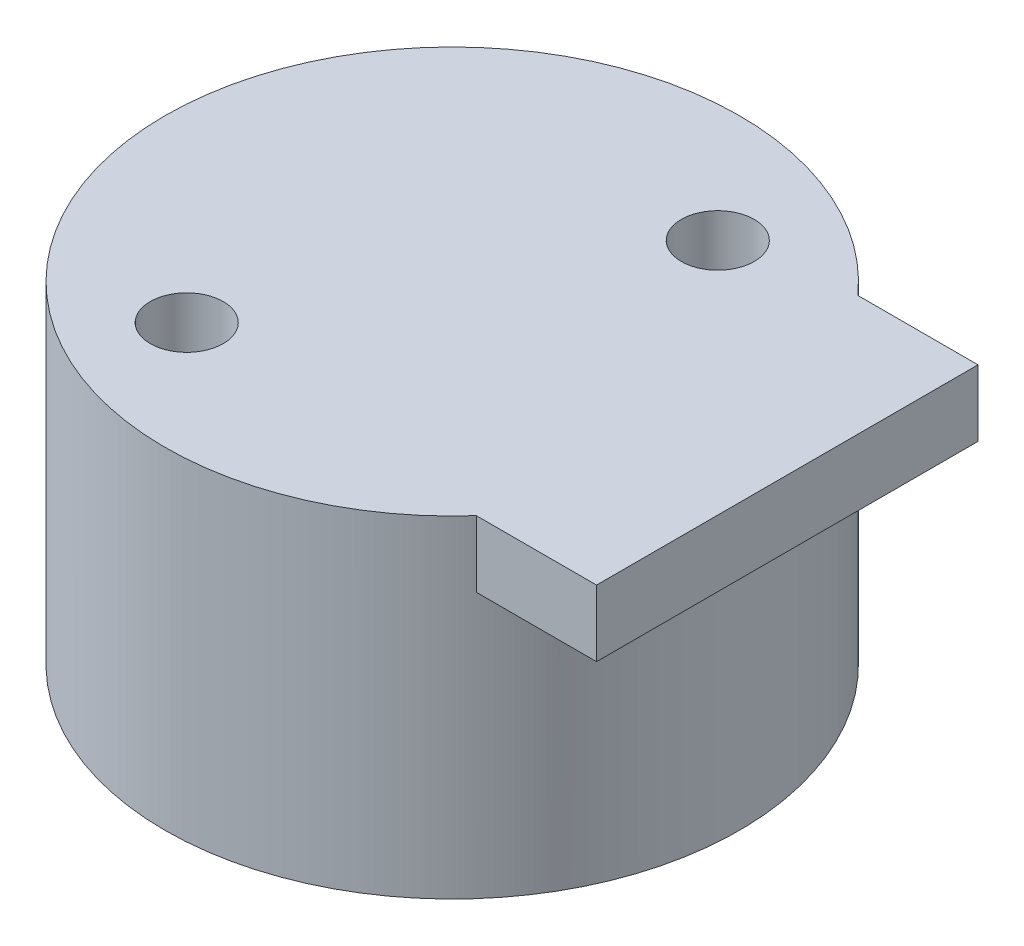
ISO-10303-21;
HEADER;
FILE_DESCRIPTION(('STEP AP214'),'2;1');
FILE_NAME('part.step','',(''),(''),'','','');
FILE_SCHEMA(('AUTOMOTIVE_DESIGN { 1 0 10303 214 1 1 1 1 }'));
ENDSEC;
DATA;
#1=APPLICATION_CONTEXT('core data for automotive mechanical design processes');
#2=APPLICATION_PROTOCOL_DEFINITION('international standard','automotive_design',2000,#1);
#3=PRODUCT_CONTEXT('',#1,'mechanical');
#4=PRODUCT('Part','Part','',(#3));
#5=PRODUCT_RELATED_PRODUCT_CATEGORY('part','',(#4));
#6=PRODUCT_DEFINITION_FORMATION('','',#4);
#7=PRODUCT_DEFINITION_CONTEXT('part definition',#1,'design');
#8=PRODUCT_DEFINITION('design','',#6,#7);
#9=PRODUCT_DEFINITION_SHAPE('','',#8);
#10=(LENGTH_UNIT() NAMED_UNIT(*) SI_UNIT(.MILLI.,.METRE.));
#11=(NAMED_UNIT(*) PLANE_ANGLE_UNIT() SI_UNIT($,.RADIAN.));
#12=(NAMED_UNIT(*) SI_UNIT($,.STERADIAN.) SOLID_ANGLE_UNIT());
#13=UNCERTAINTY_MEASURE_WITH_UNIT(LENGTH_MEASURE(1.E-05),#10,'distance_accuracy_value','');
#14=(GEOMETRIC_REPRESENTATION_CONTEXT(3) GLOBAL_UNCERTAINTY_ASSIGNED_CONTEXT((#13)) GLOBAL_UNIT_ASSIGNED_CONTEXT((#10,
#11,#12)) REPRESENTATION_CONTEXT('',''));
#15=CARTESIAN_POINT('',(0.,0.,0.));
#16=DIRECTION('',(0.,0.,1.));
#17=DIRECTION('',(1.,0.,0.));
#18=AXIS2_PLACEMENT_3D('',#15,#16,#17);
#19=CARTESIAN_POINT('',(-3.72109999999998,12.7,6.44513426004456));
#20=DIRECTION('',(0.,-1.,0.));
#21=DIRECTION('',(0.,0.,-1.));
#22=AXIS2_PLACEMENT_3D('',#19,#20,#21);
#23=CYLINDRICAL_SURFACE('',#22,1.397);
#24=CARTESIAN_POINT('',(-3.72109999999998,12.7,6.44513426004456));
#25=DIRECTION('',(0.,1.,0.));
#26=DIRECTION('',(0.,0.,1.));
#27=AXIS2_PLACEMENT_3D('',#24,#25,#26);
#28=CIRCLE('',#27,1.397);
#29=CARTESIAN_POINT('',(-3.72109999999998,12.7,7.84213426004456));
#30=VERTEX_POINT('',#29);
#31=EDGE_CURVE('E110',#30,#30,#28,.T.);
#32=ORIENTED_EDGE('',*,*,#31,.T.);
#33=EDGE_LOOP('',(#32));
#34=FACE_BOUND('',#33,.T.);
#35=CARTESIAN_POINT('',(-3.72109999999998,0.,6.44513426004456));
#36=DIRECTION('',(0.,1.,0.));
#37=DIRECTION('',(0.,0.,1.));
#38=AXIS2_PLACEMENT_3D('',#35,#36,#37);
#39=CIRCLE('',#38,1.397);
#40=CARTESIAN_POINT('',(-3.72109999999998,0.,7.84213426004456));
#41=VERTEX_POINT('',#40);
#42=EDGE_CURVE('E117',#41,#41,#39,.T.);
#43=ORIENTED_EDGE('',*,*,#42,.F.);
#44=EDGE_LOOP('',(#43));
#45=FACE_BOUND('',#44,.T.);
#46=ADVANCED_FACE('F35',(#34,#45),#23,.F.);
#47=CARTESIAN_POINT('',(3.72109999999998,12.7,-6.44513426004456));
#48=DIRECTION('',(0.,-1.,0.));
#49=DIRECTION('',(0.,0.,-1.));
#50=AXIS2_PLACEMENT_3D('',#47,#48,#49);
#51=CYLINDRICAL_SURFACE('',#50,1.397);
#52=CARTESIAN_POINT('',(3.72109999999998,12.7,-6.44513426004456));
#53=DIRECTION('',(0.,1.,0.));
#54=DIRECTION('',(0.,0.,1.));
#55=AXIS2_PLACEMENT_3D('',#52,#53,#54);
#56=CIRCLE('',#55,1.397);
#57=CARTESIAN_POINT('',(3.72109999999998,12.7,-5.04813426004456));
#58=VERTEX_POINT('',#57);
#59=EDGE_CURVE('E107',#58,#58,#56,.T.);
#60=ORIENTED_EDGE('',*,*,#59,.T.);
#61=EDGE_LOOP('',(#60));
#62=FACE_BOUND('',#61,.T.);
#63=CARTESIAN_POINT('',(3.72109999999998,0.,-6.44513426004456));
#64=DIRECTION('',(0.,1.,0.));
#65=DIRECTION('',(0.,0.,1.));
#66=AXIS2_PLACEMENT_3D('',#63,#64,#65);
#67=CIRCLE('',#66,1.397);
#68=CARTESIAN_POINT('',(3.72109999999998,0.,-5.04813426004456));
#69=VERTEX_POINT('',#68);
#70=EDGE_CURVE('E104',#69,#69,#67,.T.);
#71=ORIENTED_EDGE('',*,*,#70,.F.);
#72=EDGE_LOOP('',(#71));
#73=FACE_BOUND('',#72,.T.);
#74=ADVANCED_FACE('F37',(#62,#73),#51,.F.);
#75=CARTESIAN_POINT('',(0.,12.7,0.));
#76=DIRECTION('',(0.,-1.,0.));
#77=DIRECTION('',(0.,0.,-1.));
#78=AXIS2_PLACEMENT_3D('',#75,#76,#77);
#79=CYLINDRICAL_SURFACE('',#78,10.9982);
#80=CARTESIAN_POINT('',(0.,12.7,0.));
#81=DIRECTION('',(0.,1.,0.));
#82=DIRECTION('',(0.,0.,1.));
#83=AXIS2_PLACEMENT_3D('',#80,#81,#82);
#84=CIRCLE('',#83,10.9982);
#85=CARTESIAN_POINT('',(8.22398303682589,12.7,-7.3025));
#86=VERTEX_POINT('',#85);
#87=CARTESIAN_POINT('',(8.22398303682589,12.7,7.30250000000001));
#88=VERTEX_POINT('',#87);
#89=EDGE_CURVE('E43',#86,#88,#84,.T.);
#90=ORIENTED_EDGE('',*,*,#89,.F.);
#91=DIRECTION('',(0.,1.,0.));
#92=VECTOR('',#91,1.);
#93=CARTESIAN_POINT('',(8.22398303682589,10.16,-7.3025));
#94=LINE('',#93,#92);
#95=CARTESIAN_POINT('',(8.22398303682589,10.16,-7.3025));
#96=VERTEX_POINT('',#95);
#97=EDGE_CURVE('E102',#96,#86,#94,.T.);
#98=ORIENTED_EDGE('',*,*,#97,.F.);
#99=CARTESIAN_POINT('',(0.,10.16,0.));
#100=DIRECTION('',(0.,1.,0.));
#101=DIRECTION('',(0.,0.,1.));
#102=AXIS2_PLACEMENT_3D('',#99,#100,#101);
#103=CIRCLE('',#102,10.9982);
#104=CARTESIAN_POINT('',(8.22398303682589,10.16,7.30250000000001));
#105=VERTEX_POINT('',#104);
#106=EDGE_CURVE('E11',#105,#96,#103,.T.);
#107=ORIENTED_EDGE('',*,*,#106,.F.);
#108=DIRECTION('',(0.,1.,0.));
#109=VECTOR('',#108,1.);
#110=CARTESIAN_POINT('',(8.22398303682589,10.16,7.30250000000001));
#111=LINE('',#110,#109);
#112=EDGE_CURVE('E81',#105,#88,#111,.T.);
#113=ORIENTED_EDGE('',*,*,#112,.T.);
#114=EDGE_LOOP('',(#90,#98,#107,#113));
#115=FACE_BOUND('',#114,.T.);
#116=CARTESIAN_POINT('',(0.,0.,0.));
#117=DIRECTION('',(0.,1.,0.));
#118=DIRECTION('',(0.,0.,1.));
#119=AXIS2_PLACEMENT_3D('',#116,#117,#118);
#120=CIRCLE('',#119,10.9982);
#121=CARTESIAN_POINT('',(0.,0.,10.9982));
#122=VERTEX_POINT('',#121);
#123=EDGE_CURVE('E111',#122,#122,#120,.T.);
#124=ORIENTED_EDGE('',*,*,#123,.T.);
#125=EDGE_LOOP('',(#124));
#126=FACE_BOUND('',#125,.T.);
#127=ADVANCED_FACE('F122',(#115,#126),#79,.T.);
#128=CARTESIAN_POINT('',(0.,12.7,0.));
#129=DIRECTION('',(0.,1.,0.));
#130=DIRECTION('',(0.,0.,1.));
#131=AXIS2_PLACEMENT_3D('',#128,#129,#130);
#132=PLANE('',#131);
#133=ORIENTED_EDGE('',*,*,#89,.T.);
#134=DIRECTION('',(1.,0.,0.));
#135=VECTOR('',#134,1.);
#136=CARTESIAN_POINT('',(8.22398303682589,12.7,7.30250000000001));
#137=LINE('',#136,#135);
#138=CARTESIAN_POINT('',(12.827,12.7,7.3025));
#139=VERTEX_POINT('',#138);
#140=EDGE_CURVE('E99',#88,#139,#137,.T.);
#141=ORIENTED_EDGE('',*,*,#140,.T.);
#142=DIRECTION('',(0.,0.,-1.));
#143=VECTOR('',#142,1.);
#144=CARTESIAN_POINT('',(12.827,12.7,-7.3025));
#145=LINE('',#144,#143);
#146=CARTESIAN_POINT('',(12.827,12.7,-7.3025));
#147=VERTEX_POINT('',#146);
#148=EDGE_CURVE('E87',#139,#147,#145,.T.);
#149=ORIENTED_EDGE('',*,*,#148,.T.);
#150=DIRECTION('',(-1.,0.,0.));
#151=VECTOR('',#150,1.);
#152=CARTESIAN_POINT('',(8.22398303682589,12.7,-7.3025));
#153=LINE('',#152,#151);
#154=EDGE_CURVE('E50',#147,#86,#153,.T.);
#155=ORIENTED_EDGE('',*,*,#154,.T.);
#156=EDGE_LOOP('',(#133,#141,#149,#155));
#157=FACE_BOUND('',#156,.T.);
#158=ORIENTED_EDGE('',*,*,#59,.F.);
#159=EDGE_LOOP('',(#158));
#160=FACE_BOUND('',#159,.T.);
#161=ORIENTED_EDGE('',*,*,#31,.F.);
#162=EDGE_LOOP('',(#161));
#163=FACE_BOUND('',#162,.T.);
#164=ADVANCED_FACE('F127',(#157,#160,#163),#132,.T.);
#165=CARTESIAN_POINT('',(0.,0.,0.));
#166=DIRECTION('',(0.,1.,0.));
#167=DIRECTION('',(0.,0.,1.));
#168=AXIS2_PLACEMENT_3D('',#165,#166,#167);
#169=PLANE('',#168);
#170=ORIENTED_EDGE('',*,*,#70,.T.);
#171=EDGE_LOOP('',(#170));
#172=FACE_BOUND('',#171,.T.);
#173=ORIENTED_EDGE('',*,*,#42,.T.);
#174=EDGE_LOOP('',(#173));
#175=FACE_BOUND('',#174,.T.);
#176=ORIENTED_EDGE('',*,*,#123,.F.);
#177=EDGE_LOOP('',(#176));
#178=FACE_BOUND('',#177,.T.);
#179=ADVANCED_FACE('F124',(#172,#175,#178),#169,.F.);
#180=CARTESIAN_POINT('',(8.22398303682589,10.16,-7.3025));
#181=DIRECTION('',(0.,0.,-1.));
#182=DIRECTION('',(-1.,0.,0.));
#183=AXIS2_PLACEMENT_3D('',#180,#181,#182);
#184=PLANE('',#183);
#185=ORIENTED_EDGE('',*,*,#154,.F.);
#186=DIRECTION('',(0.,1.,0.));
#187=VECTOR('',#186,1.);
#188=CARTESIAN_POINT('',(12.827,10.16,-7.3025));
#189=LINE('',#188,#187);
#190=CARTESIAN_POINT('',(12.827,10.16,-7.3025));
#191=VERTEX_POINT('',#190);
#192=EDGE_CURVE('E75',#191,#147,#189,.T.);
#193=ORIENTED_EDGE('',*,*,#192,.F.);
#194=DIRECTION('',(-1.,0.,0.));
#195=VECTOR('',#194,1.);
#196=CARTESIAN_POINT('',(8.22398303682589,10.16,-7.3025));
#197=LINE('',#196,#195);
#198=EDGE_CURVE('E92',#191,#96,#197,.T.);
#199=ORIENTED_EDGE('',*,*,#198,.T.);
#200=ORIENTED_EDGE('',*,*,#97,.T.);
#201=EDGE_LOOP('',(#185,#193,#199,#200));
#202=FACE_BOUND('',#201,.T.);
#203=ADVANCED_FACE('F126',(#202),#184,.T.);
#204=CARTESIAN_POINT('',(12.827,10.16,-7.3025));
#205=DIRECTION('',(1.,0.,0.));
#206=DIRECTION('',(0.,0.,-1.));
#207=AXIS2_PLACEMENT_3D('',#204,#205,#206);
#208=PLANE('',#207);
#209=ORIENTED_EDGE('',*,*,#148,.F.);
#210=DIRECTION('',(0.,1.,0.));
#211=VECTOR('',#210,1.);
#212=CARTESIAN_POINT('',(12.827,10.16,7.3025));
#213=LINE('',#212,#211);
#214=CARTESIAN_POINT('',(12.827,10.16,7.3025));
#215=VERTEX_POINT('',#214);
#216=EDGE_CURVE('E83',#215,#139,#213,.T.);
#217=ORIENTED_EDGE('',*,*,#216,.F.);
#218=DIRECTION('',(0.,0.,-1.));
#219=VECTOR('',#218,1.);
#220=CARTESIAN_POINT('',(12.827,10.16,-7.3025));
#221=LINE('',#220,#219);
#222=EDGE_CURVE('E86',#215,#191,#221,.T.);
#223=ORIENTED_EDGE('',*,*,#222,.T.);
#224=ORIENTED_EDGE('',*,*,#192,.T.);
#225=EDGE_LOOP('',(#209,#217,#223,#224));
#226=FACE_BOUND('',#225,.T.);
#227=ADVANCED_FACE('F85',(#226),#208,.T.);
#228=CARTESIAN_POINT('',(8.22398303682589,10.16,7.30250000000001));
#229=DIRECTION('',(0.,0.,1.));
#230=DIRECTION('',(1.,0.,0.));
#231=AXIS2_PLACEMENT_3D('',#228,#229,#230);
#232=PLANE('',#231);
#233=ORIENTED_EDGE('',*,*,#140,.F.);
#234=ORIENTED_EDGE('',*,*,#112,.F.);
#235=DIRECTION('',(1.,0.,0.));
#236=VECTOR('',#235,1.);
#237=CARTESIAN_POINT('',(8.22398303682589,10.16,7.30250000000001));
#238=LINE('',#237,#236);
#239=EDGE_CURVE('E91',#105,#215,#238,.T.);
#240=ORIENTED_EDGE('',*,*,#239,.T.);
#241=ORIENTED_EDGE('',*,*,#216,.T.);
#242=EDGE_LOOP('',(#233,#234,#240,#241));
#243=FACE_BOUND('',#242,.T.);
#244=ADVANCED_FACE('F94',(#243),#232,.T.);
#245=CARTESIAN_POINT('',(0.,10.16,0.));
#246=DIRECTION('',(0.,1.,0.));
#247=DIRECTION('',(0.,0.,1.));
#248=AXIS2_PLACEMENT_3D('',#245,#246,#247);
#249=PLANE('',#248);
#250=ORIENTED_EDGE('',*,*,#239,.F.);
#251=ORIENTED_EDGE('',*,*,#106,.T.);
#252=ORIENTED_EDGE('',*,*,#198,.F.);
#253=ORIENTED_EDGE('',*,*,#222,.F.);
#254=EDGE_LOOP('',(#250,#251,#252,#253));
#255=FACE_BOUND('',#254,.T.);
#256=ADVANCED_FACE('F90',(#255),#249,.F.);
#257=CLOSED_SHELL('',(#46,#74,#127,#164,#179,#203,#227,#244,#256));
#258=MANIFOLD_SOLID_BREP('B2',#257);
#259=ADVANCED_BREP_SHAPE_REPRESENTATION('',(#18,#258),#14);
#260=SHAPE_DEFINITION_REPRESENTATION(#9,#259);
ENDSEC;
END-ISO-10303-21;
